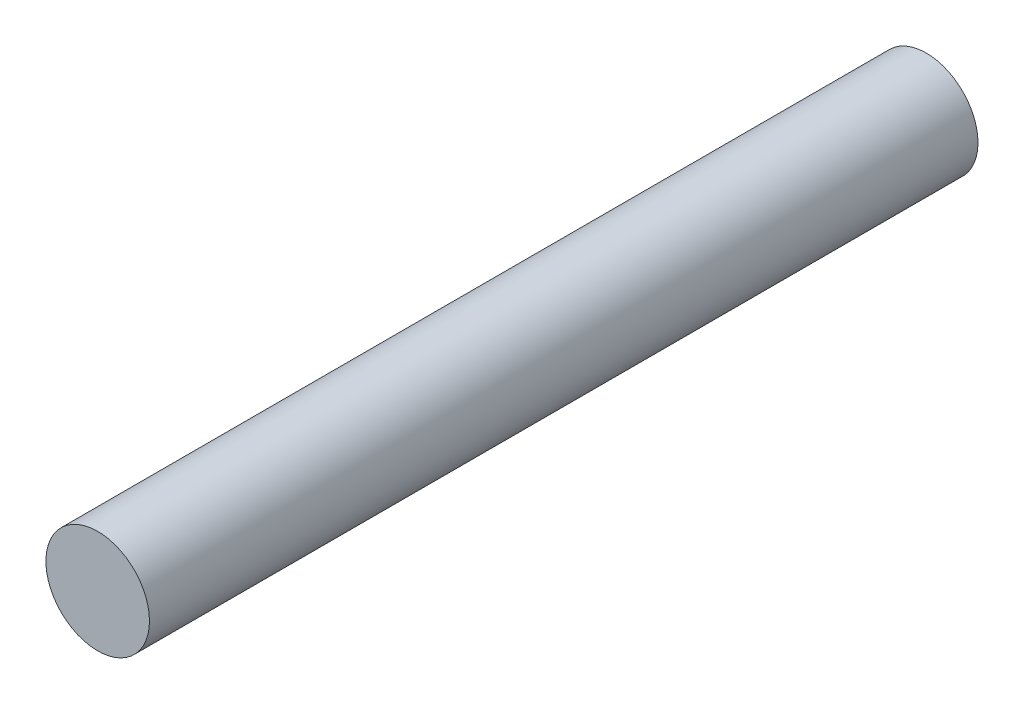
ISO-10303-21;
HEADER;
FILE_DESCRIPTION(('STEP AP214'),'2;1');
FILE_NAME('part.step','',(''),(''),'','','');
FILE_SCHEMA(('AUTOMOTIVE_DESIGN { 1 0 10303 214 1 1 1 1 }'));
ENDSEC;
DATA;
#1=APPLICATION_CONTEXT('core data for automotive mechanical design processes');
#2=APPLICATION_PROTOCOL_DEFINITION('international standard','automotive_design',2000,#1);
#3=PRODUCT_CONTEXT('',#1,'mechanical');
#4=PRODUCT('Part','Part','',(#3));
#5=PRODUCT_RELATED_PRODUCT_CATEGORY('part','',(#4));
#6=PRODUCT_DEFINITION_FORMATION('','',#4);
#7=PRODUCT_DEFINITION_CONTEXT('part definition',#1,'design');
#8=PRODUCT_DEFINITION('design','',#6,#7);
#9=PRODUCT_DEFINITION_SHAPE('','',#8);
#10=(LENGTH_UNIT() NAMED_UNIT(*) SI_UNIT(.MILLI.,.METRE.));
#11=(NAMED_UNIT(*) PLANE_ANGLE_UNIT() SI_UNIT($,.RADIAN.));
#12=(NAMED_UNIT(*) SI_UNIT($,.STERADIAN.) SOLID_ANGLE_UNIT());
#13=UNCERTAINTY_MEASURE_WITH_UNIT(LENGTH_MEASURE(1.E-05),#10,'distance_accuracy_value','');
#14=(GEOMETRIC_REPRESENTATION_CONTEXT(3) GLOBAL_UNCERTAINTY_ASSIGNED_CONTEXT((#13)) GLOBAL_UNIT_ASSIGNED_CONTEXT((#10,
#11,#12)) REPRESENTATION_CONTEXT('',''));
#15=CARTESIAN_POINT('',(0.,0.,0.));
#16=DIRECTION('',(0.,0.,1.));
#17=DIRECTION('',(1.,0.,0.));
#18=AXIS2_PLACEMENT_3D('',#15,#16,#17);
#19=CARTESIAN_POINT('',(0.,0.,48.));
#20=DIRECTION('',(0.,0.,-1.));
#21=DIRECTION('',(-1.,0.,0.));
#22=AXIS2_PLACEMENT_3D('',#19,#20,#21);
#23=CYLINDRICAL_SURFACE('',#22,3.);
#24=CARTESIAN_POINT('',(0.,0.,48.));
#25=DIRECTION('',(0.,0.,1.));
#26=DIRECTION('',(1.,0.,0.));
#27=AXIS2_PLACEMENT_3D('',#24,#25,#26);
#28=CIRCLE('',#27,3.);
#29=CARTESIAN_POINT('',(3.,0.,48.));
#30=VERTEX_POINT('',#29);
#31=EDGE_CURVE('E10',#30,#30,#28,.T.);
#32=ORIENTED_EDGE('',*,*,#31,.F.);
#33=EDGE_LOOP('',(#32));
#34=FACE_BOUND('',#33,.T.);
#35=CARTESIAN_POINT('',(0.,0.,0.));
#36=DIRECTION('',(0.,0.,1.));
#37=DIRECTION('',(1.,0.,0.));
#38=AXIS2_PLACEMENT_3D('',#35,#36,#37);
#39=CIRCLE('',#38,3.);
#40=CARTESIAN_POINT('',(3.,0.,0.));
#41=VERTEX_POINT('',#40);
#42=EDGE_CURVE('E35',#41,#41,#39,.T.);
#43=ORIENTED_EDGE('',*,*,#42,.T.);
#44=EDGE_LOOP('',(#43));
#45=FACE_BOUND('',#44,.T.);
#46=ADVANCED_FACE('F32',(#34,#45),#23,.T.);
#47=CARTESIAN_POINT('',(0.,0.,48.));
#48=DIRECTION('',(0.,0.,1.));
#49=DIRECTION('',(1.,0.,0.));
#50=AXIS2_PLACEMENT_3D('',#47,#48,#49);
#51=PLANE('',#50);
#52=ORIENTED_EDGE('',*,*,#31,.T.);
#53=EDGE_LOOP('',(#52));
#54=FACE_BOUND('',#53,.T.);
#55=ADVANCED_FACE('F47',(#54),#51,.T.);
#56=CARTESIAN_POINT('',(0.,0.,0.));
#57=DIRECTION('',(0.,0.,1.));
#58=DIRECTION('',(1.,0.,0.));
#59=AXIS2_PLACEMENT_3D('',#56,#57,#58);
#60=PLANE('',#59);
#61=ORIENTED_EDGE('',*,*,#42,.F.);
#62=EDGE_LOOP('',(#61));
#63=FACE_BOUND('',#62,.T.);
#64=ADVANCED_FACE('F45',(#63),#60,.F.);
#65=CLOSED_SHELL('',(#46,#55,#64));
#66=MANIFOLD_SOLID_BREP('B2',#65);
#67=ADVANCED_BREP_SHAPE_REPRESENTATION('',(#18,#66),#14);
#68=SHAPE_DEFINITION_REPRESENTATION(#9,#67);
ENDSEC;
END-ISO-10303-21;
